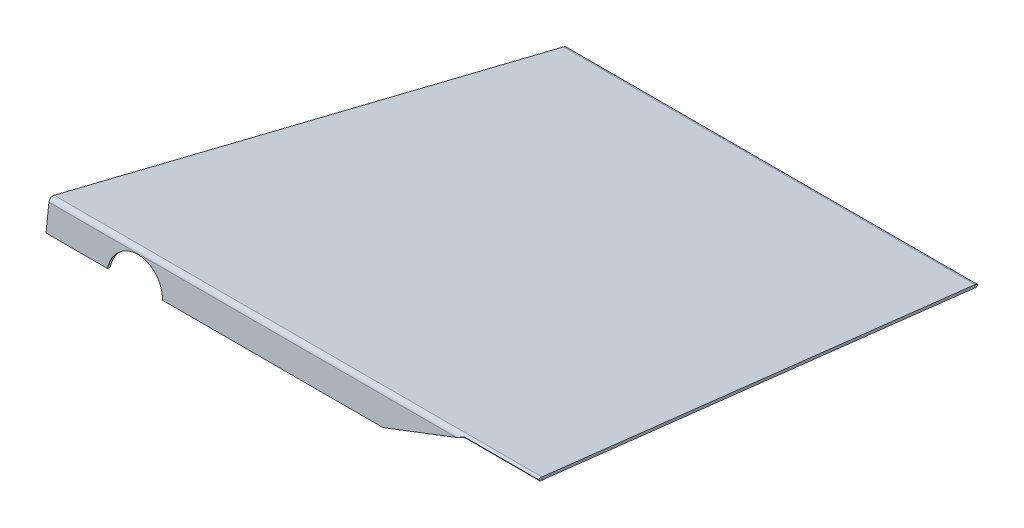
ISO-10303-21;
HEADER;
FILE_DESCRIPTION(('STEP AP214'),'2;1');
FILE_NAME('part.step','',(''),(''),'','','');
FILE_SCHEMA(('AUTOMOTIVE_DESIGN { 1 0 10303 214 1 1 1 1 }'));
ENDSEC;
DATA;
#1=APPLICATION_CONTEXT('core data for automotive mechanical design processes');
#2=APPLICATION_PROTOCOL_DEFINITION('international standard','automotive_design',2000,#1);
#3=PRODUCT_CONTEXT('',#1,'mechanical');
#4=PRODUCT('Part','Part','',(#3));
#5=PRODUCT_RELATED_PRODUCT_CATEGORY('part','',(#4));
#6=PRODUCT_DEFINITION_FORMATION('','',#4);
#7=PRODUCT_DEFINITION_CONTEXT('part definition',#1,'design');
#8=PRODUCT_DEFINITION('design','',#6,#7);
#9=PRODUCT_DEFINITION_SHAPE('','',#8);
#10=(LENGTH_UNIT() NAMED_UNIT(*) SI_UNIT(.MILLI.,.METRE.));
#11=(NAMED_UNIT(*) PLANE_ANGLE_UNIT() SI_UNIT($,.RADIAN.));
#12=(NAMED_UNIT(*) SI_UNIT($,.STERADIAN.) SOLID_ANGLE_UNIT());
#13=UNCERTAINTY_MEASURE_WITH_UNIT(LENGTH_MEASURE(1.E-05),#10,'distance_accuracy_value','');
#14=(GEOMETRIC_REPRESENTATION_CONTEXT(3) GLOBAL_UNCERTAINTY_ASSIGNED_CONTEXT((#13)) GLOBAL_UNIT_ASSIGNED_CONTEXT((#10,
#11,#12)) REPRESENTATION_CONTEXT('',''));
#15=CARTESIAN_POINT('',(0.,0.,0.));
#16=DIRECTION('',(0.,0.,1.));
#17=DIRECTION('',(1.,0.,0.));
#18=AXIS2_PLACEMENT_3D('',#15,#16,#17);
#19=CARTESIAN_POINT('',(-275.824024886329,332.806963333111,-148.582796348313));
#20=DIRECTION('',(0.,-0.993404762241954,0.114660273656605));
#21=DIRECTION('',(0.,-0.114660273656605,-0.993404762241954));
#22=AXIS2_PLACEMENT_3D('',#19,#20,#21);
#23=PLANE('',#22);
#24=DIRECTION('',(0.,-0.114660273656609,-0.993404762241953));
#25=VECTOR('',#24,1.);
#26=CARTESIAN_POINT('',(-247.624135177721,338.878637346236,-95.9784401308918));
#27=LINE('',#26,#25);
#28=CARTESIAN_POINT('',(-247.624135177723,332.806963333111,-148.582796348313));
#29=VERTEX_POINT('',#28);
#30=CARTESIAN_POINT('',(-247.624135177723,332.664257156518,-149.8191879154));
#31=VERTEX_POINT('',#30);
#32=EDGE_CURVE('E96',#29,#31,#27,.T.);
#33=ORIENTED_EDGE('',*,*,#32,.F.);
#34=DIRECTION('',(-1.,0.,0.));
#35=VECTOR('',#34,1.);
#36=CARTESIAN_POINT('',(-275.824024886329,332.806963333111,-148.582796348313));
#37=LINE('',#36,#35);
#38=CARTESIAN_POINT('',(-275.824024886329,332.806963333111,-148.582796348313));
#39=VERTEX_POINT('',#38);
#40=EDGE_CURVE('E623',#29,#39,#37,.T.);
#41=ORIENTED_EDGE('',*,*,#40,.T.);
#42=DIRECTION('',(0.,-0.114660273656605,-0.993404762241954));
#43=VECTOR('',#42,1.);
#44=CARTESIAN_POINT('',(-275.824024886329,332.806963333111,-148.582796348313));
#45=LINE('',#44,#43);
#46=CARTESIAN_POINT('',(-275.824024886329,332.664257156518,-149.8191879154));
#47=VERTEX_POINT('',#46);
#48=EDGE_CURVE('E619',#39,#47,#45,.T.);
#49=ORIENTED_EDGE('',*,*,#48,.T.);
#50=DIRECTION('',(-1.,0.,0.));
#51=VECTOR('',#50,1.);
#52=CARTESIAN_POINT('',(-275.824024886329,332.664257156518,-149.8191879154));
#53=LINE('',#52,#51);
#54=EDGE_CURVE('E607',#31,#47,#53,.T.);
#55=ORIENTED_EDGE('',*,*,#54,.F.);
#56=EDGE_LOOP('',(#33,#41,#49,#55));
#57=FACE_BOUND('',#56,.T.);
#58=ADVANCED_FACE('F81',(#57),#23,.T.);
#59=CARTESIAN_POINT('',(-2.63217050938053E-12,357.643485234279,-41.2797496520134));
#60=DIRECTION('',(0.,0.993404762241953,-0.114660273656609));
#61=DIRECTION('',(0.,0.114660273656609,0.993404762241953));
#62=AXIS2_PLACEMENT_3D('',#59,#60,#61);
#63=PLANE('',#62);
#64=DIRECTION('',(0.172013381605638,-0.112951217903472,-0.978597679806526));
#65=VECTOR('',#64,1.);
#66=CARTESIAN_POINT('',(-240.551572244694,321.82854127128,-351.576723116623));
#67=LINE('',#66,#65);
#68=CARTESIAN_POINT('',(-275.63766103811,344.867542212332,-151.969199758698));
#69=VERTEX_POINT('',#68);
#70=CARTESIAN_POINT('',(-240.737936092912,321.950915608864,-350.516484501672));
#71=VERTEX_POINT('',#70);
#72=EDGE_CURVE('E491',#69,#71,#67,.T.);
#73=ORIENTED_EDGE('',*,*,#72,.T.);
#74=DIRECTION('',(1.,0.,0.));
#75=VECTOR('',#74,1.);
#76=CARTESIAN_POINT('',(-2.48167277198549E-12,321.950915608866,-350.516484501672));
#77=LINE('',#76,#75);
#78=CARTESIAN_POINT('',(-51.9999999999785,321.950915608865,-350.516484501672));
#79=VERTEX_POINT('',#78);
#80=EDGE_CURVE('E459',#71,#79,#77,.T.);
#81=ORIENTED_EDGE('',*,*,#80,.T.);
#82=DIRECTION('',(0.,0.114660273656609,0.993404762241953));
#83=VECTOR('',#82,1.);
#84=CARTESIAN_POINT('',(-51.9999999999785,321.828541271282,-351.576723116623));
#85=LINE('',#84,#83);
#86=CARTESIAN_POINT('',(-51.9999999999785,344.867542212333,-151.969199758698));
#87=VERTEX_POINT('',#86);
#88=EDGE_CURVE('E488',#79,#87,#85,.T.);
#89=ORIENTED_EDGE('',*,*,#88,.T.);
#90=DIRECTION('',(1.,0.,0.));
#91=VECTOR('',#90,1.);
#92=CARTESIAN_POINT('',(-2.64271054348893E-12,344.867542212334,-151.969199758699));
#93=LINE('',#92,#91);
#94=EDGE_CURVE('E766',#69,#87,#93,.T.);
#95=ORIENTED_EDGE('',*,*,#94,.F.);
#96=EDGE_LOOP('',(#73,#81,#89,#95));
#97=FACE_BOUND('',#96,.T.);
#98=ADVANCED_FACE('F83',(#97),#63,.F.);
#99=CARTESIAN_POINT('',(-51.9999999999785,323.064932838368,-351.719429293216));
#100=DIRECTION('',(1.,0.,0.));
#101=DIRECTION('',(0.,1.,0.));
#102=AXIS2_PLACEMENT_3D('',#99,#100,#101);
#103=PLANE('',#102);
#104=DIRECTION('',(0.,-0.993404762241953,0.114660273656609));
#105=VECTOR('',#104,1.);
#106=CARTESIAN_POINT('',(-51.9999999999785,323.187307175951,-350.659190678265));
#107=LINE('',#106,#105);
#108=CARTESIAN_POINT('',(-51.9999999999785,323.187307175951,-350.659190678265));
#109=VERTEX_POINT('',#108);
#110=EDGE_CURVE('E469',#109,#79,#107,.T.);
#111=ORIENTED_EDGE('',*,*,#110,.F.);
#112=DIRECTION('',(0.,0.114660273656609,0.993404762241953));
#113=VECTOR('',#112,1.);
#114=CARTESIAN_POINT('',(-51.9999999999785,323.064932838368,-351.719429293216));
#115=LINE('',#114,#113);
#116=CARTESIAN_POINT('',(-51.9999999999785,346.10393377942,-152.111905935292));
#117=VERTEX_POINT('',#116);
#118=EDGE_CURVE('E484',#109,#117,#115,.T.);
#119=ORIENTED_EDGE('',*,*,#118,.T.);
#120=DIRECTION('',(0.,-0.993404762241953,0.114660273656609));
#121=VECTOR('',#120,1.);
#122=CARTESIAN_POINT('',(-51.9999999999785,346.10393377942,-152.111905935292));
#123=LINE('',#122,#121);
#124=EDGE_CURVE('E476',#117,#87,#123,.T.);
#125=ORIENTED_EDGE('',*,*,#124,.T.);
#126=ORIENTED_EDGE('',*,*,#88,.F.);
#127=EDGE_LOOP('',(#111,#119,#125,#126));
#128=FACE_BOUND('',#127,.T.);
#129=ADVANCED_FACE('F520',(#128),#103,.T.);
#130=CARTESIAN_POINT('',(-240.551572244694,323.064932838367,-351.719429293216));
#131=DIRECTION('',(-0.985094612993388,-0.0197231014075078,-0.170878912456383));
#132=DIRECTION('',(-0.170912158166921,0.,0.985286270172647));
#133=AXIS2_PLACEMENT_3D('',#130,#131,#132);
#134=PLANE('',#133);
#135=CARTESIAN_POINT('',(-240.737936092912,321.950915608864,-350.516484501672));
#136=CARTESIAN_POINT('',(-240.737936092912,323.18730717595,-350.659190678265));
#137=B_SPLINE_CURVE_WITH_KNOTS('',1,(#135,#136),.UNSPECIFIED.,.F.,.F.,(2,2),(0.,1.),.UNSPECIFIED.);
#138=CARTESIAN_POINT('',(-240.737936092912,323.18730717595,-350.659190678265));
#139=VERTEX_POINT('',#138);
#140=EDGE_CURVE('E89',#71,#139,#137,.T.);
#141=ORIENTED_EDGE('',*,*,#140,.F.);
#142=ORIENTED_EDGE('',*,*,#72,.F.);
#143=CARTESIAN_POINT('',(-275.63766103811,346.103933779418,-152.111905935291));
#144=CARTESIAN_POINT('',(-275.63766103811,344.867542212332,-151.969199758698));
#145=B_SPLINE_CURVE_WITH_KNOTS('',1,(#143,#144),.UNSPECIFIED.,.F.,.F.,(2,2),(0.,1.),.UNSPECIFIED.);
#146=CARTESIAN_POINT('',(-275.63766103811,346.103933779418,-152.111905935291));
#147=VERTEX_POINT('',#146);
#148=EDGE_CURVE('E504',#69,#147,#145,.F.);
#149=ORIENTED_EDGE('',*,*,#148,.T.);
#150=DIRECTION('',(0.172013381605638,-0.112951217903472,-0.978597679806526));
#151=VECTOR('',#150,1.);
#152=CARTESIAN_POINT('',(-240.551572244694,323.064932838367,-351.719429293216));
#153=LINE('',#152,#151);
#154=EDGE_CURVE('E487',#147,#139,#153,.T.);
#155=ORIENTED_EDGE('',*,*,#154,.T.);
#156=EDGE_LOOP('',(#141,#142,#149,#155));
#157=FACE_BOUND('',#156,.T.);
#158=ADVANCED_FACE('F510',(#157),#134,.T.);
#159=CARTESIAN_POINT('',(-2.64068036971816E-12,358.879876801365,-41.4224558286064));
#160=DIRECTION('',(0.,0.993404762241953,-0.114660273656609));
#161=DIRECTION('',(0.,0.114660273656609,0.993404762241953));
#162=AXIS2_PLACEMENT_3D('',#159,#160,#161);
#163=PLANE('',#162);
#164=DIRECTION('',(1.,0.,0.));
#165=VECTOR('',#164,1.);
#166=CARTESIAN_POINT('',(-2.49018263232312E-12,323.187307175952,-350.659190678265));
#167=LINE('',#166,#165);
#168=EDGE_CURVE('E473',#139,#109,#167,.T.);
#169=ORIENTED_EDGE('',*,*,#168,.F.);
#170=ORIENTED_EDGE('',*,*,#154,.F.);
#171=DIRECTION('',(1.,0.,0.));
#172=VECTOR('',#171,1.);
#173=CARTESIAN_POINT('',(-2.65122040382657E-12,346.10393377942,-152.111905935292));
#174=LINE('',#173,#172);
#175=EDGE_CURVE('E486',#147,#117,#174,.T.);
#176=ORIENTED_EDGE('',*,*,#175,.T.);
#177=ORIENTED_EDGE('',*,*,#118,.F.);
#178=EDGE_LOOP('',(#169,#170,#176,#177));
#179=FACE_BOUND('',#178,.T.);
#180=ADVANCED_FACE('F519',(#179),#163,.T.);
#181=CARTESIAN_POINT('',(-275.63766103811,346.103933779418,-152.111905935291));
#182=CARTESIAN_POINT('',(-275.668727200433,346.133674885235,-151.854232067867));
#183=CARTESIAN_POINT('',(-275.69978232085,346.112168472984,-151.590838656424));
#184=CARTESIAN_POINT('',(-275.761903603589,345.969933112817,-151.092045234476));
#185=CARTESIAN_POINT('',(-275.792958724005,345.849283485954,-150.856923388411));
#186=CARTESIAN_POINT('',(-275.824024886329,345.688110684567,-150.653690311817));
#187=CARTESIAN_POINT('',(-275.63766103811,344.867542212332,-151.969199758698));
#188=CARTESIAN_POINT('',(-275.668726753126,344.878599643743,-151.873399315599));
#189=CARTESIAN_POINT('',(-275.69978232085,344.87060382917,-151.775469616555));
#190=CARTESIAN_POINT('',(-275.761903603589,344.817721451672,-151.59002078019));
#191=CARTESIAN_POINT('',(-275.792959171312,344.772863676315,-151.502602595609));
#192=CARTESIAN_POINT('',(-275.824024886329,344.712941318092,-151.427042667919));
#193=B_SPLINE_SURFACE_WITH_KNOTS('',1,3,((#181,#182,#183,#184,#185,#186),(#187,#188,#189,#190,
#191,#192)),.UNSPECIFIED.,.F.,.F.,.F.,(2,2),(4,2,4),(0.,1.),(0.,0.5,1.),.UNSPECIFIED.);
#194=CARTESIAN_POINT('',(-275.63766103811,344.867542212332,-151.969199758698));
#195=CARTESIAN_POINT('',(-275.668726753126,344.878599643743,-151.873399315599));
#196=CARTESIAN_POINT('',(-275.69978232085,344.87060382917,-151.775469616555));
#197=CARTESIAN_POINT('',(-275.761903603589,344.817721451672,-151.59002078019));
#198=CARTESIAN_POINT('',(-275.792959171312,344.772863676315,-151.502602595609));
#199=CARTESIAN_POINT('',(-275.824024886329,344.712941318092,-151.427042667919));
#200=B_SPLINE_CURVE_WITH_KNOTS('',3,(#194,#195,#196,#197,#198,#199),.UNSPECIFIED.,.F.,.F.,(4,2,
4),(0.,0.5,1.),.UNSPECIFIED.);
#201=CARTESIAN_POINT('',(-275.824024886329,344.712941318092,-151.427042667919));
#202=VERTEX_POINT('',#201);
#203=EDGE_CURVE('E689',#69,#202,#200,.T.);
#204=CARTESIAN_POINT('',(-275.824024886329,344.712941318092,-151.427042667919));
#205=CARTESIAN_POINT('',(-275.824024886329,345.688110684567,-150.653690311817));
#206=B_SPLINE_CURVE_WITH_KNOTS('',1,(#204,#205),.UNSPECIFIED.,.F.,.F.,(2,2),(0.,1.),.UNSPECIFIED.);
#207=CARTESIAN_POINT('',(-275.824024886329,345.688110684567,-150.653690311817));
#208=VERTEX_POINT('',#207);
#209=EDGE_CURVE('E746',#202,#208,#206,.T.);
#210=CARTESIAN_POINT('',(-275.824024886329,345.688110684567,-150.653690311817));
#211=CARTESIAN_POINT('',(-275.792958724005,345.849283485954,-150.856923388411));
#212=CARTESIAN_POINT('',(-275.761903603589,345.969933112817,-151.092045234476));
#213=CARTESIAN_POINT('',(-275.69978232085,346.112168472984,-151.590838656424));
#214=CARTESIAN_POINT('',(-275.668727200433,346.133674885235,-151.854232067867));
#215=CARTESIAN_POINT('',(-275.63766103811,346.103933779418,-152.111905935291));
#216=B_SPLINE_CURVE_WITH_KNOTS('',3,(#210,#211,#212,#213,#214,#215),.UNSPECIFIED.,.F.,.F.,(4,2,
4),(0.,0.5,1.),.UNSPECIFIED.);
#217=EDGE_CURVE('E635',#147,#208,#216,.F.);
#218=ORIENTED_EDGE('',*,*,#148,.F.);
#219=ORIENTED_EDGE('',*,*,#203,.T.);
#220=ORIENTED_EDGE('',*,*,#209,.T.);
#221=ORIENTED_EDGE('',*,*,#217,.F.);
#222=EDGE_LOOP('',(#218,#219,#220,#221));
#223=FACE_BOUND('',#222,.T.);
#224=ADVANCED_FACE('F706',(#223),#193,.T.);
#225=CARTESIAN_POINT('',(-275.824024886329,344.135800264464,-151.884741001123));
#226=DIRECTION('',(-1.,-3.54760169755225E-13,0.));
#227=DIRECTION('',(3.54760169755225E-13,-1.,0.));
#228=AXIS2_PLACEMENT_3D('',#225,#226,#227);
#229=PLANE('',#228);
#230=ORIENTED_EDGE('',*,*,#209,.F.);
#231=CARTESIAN_POINT('',(-275.824024886329,344.135800264464,-151.884741001123));
#232=DIRECTION('',(1.,0.,0.));
#233=DIRECTION('',(0.,1.,0.));
#234=AXIS2_PLACEMENT_3D('',#231,#232,#233);
#235=CIRCLE('',#234,0.7366);
#236=CARTESIAN_POINT('',(-275.824024886329,344.22025902204,-151.152999053255));
#237=VERTEX_POINT('',#236);
#238=EDGE_CURVE('E858',#202,#237,#235,.T.);
#239=ORIENTED_EDGE('',*,*,#238,.T.);
#240=DIRECTION('',(0.,0.114660273656605,0.993404762241954));
#241=VECTOR('',#240,1.);
#242=CARTESIAN_POINT('',(-275.824024886329,344.362965198633,-149.916607486169));
#243=LINE('',#242,#241);
#244=CARTESIAN_POINT('',(-275.824024886329,344.362965198633,-149.916607486169));
#245=VERTEX_POINT('',#244);
#246=EDGE_CURVE('E624',#237,#245,#243,.T.);
#247=ORIENTED_EDGE('',*,*,#246,.T.);
#248=CARTESIAN_POINT('',(-275.824024886329,344.135800264464,-151.884741001123));
#249=DIRECTION('',(1.,3.54760169755225E-13,0.));
#250=DIRECTION('',(3.54760169755225E-13,-1.,0.));
#251=AXIS2_PLACEMENT_3D('',#248,#249,#250);
#252=CIRCLE('',#251,1.98120000000002);
#253=EDGE_CURVE('E670',#208,#245,#252,.T.);
#254=ORIENTED_EDGE('',*,*,#253,.F.);
#255=EDGE_LOOP('',(#230,#239,#247,#254));
#256=FACE_BOUND('',#255,.T.);
#257=ADVANCED_FACE('F717',(#256),#229,.T.);
#258=CARTESIAN_POINT('',(-89.0076488850071,344.362965198634,-149.916607486169));
#259=CARTESIAN_POINT('',(-88.5134118988918,344.620603302063,-149.946344464052));
#260=CARTESIAN_POINT('',(-88.0192133899108,344.872207487118,-150.027292674442));
#261=CARTESIAN_POINT('',(-87.0307778948145,345.325483285888,-150.279417297814));
#262=CARTESIAN_POINT('',(-86.5365793858335,345.526960253255,-150.450485443077));
#263=CARTESIAN_POINT('',(-86.0423423997183,345.688110684568,-150.653690311817));
#264=CARTESIAN_POINT('',(-89.0076488850071,344.220259022041,-151.152999053256));
#265=CARTESIAN_POINT('',(-88.5134278701683,344.316044452267,-151.164054751858));
#266=CARTESIAN_POINT('',(-88.0192133899108,344.409592693401,-151.194151238639));
#267=CARTESIAN_POINT('',(-87.0307778948145,344.578118310892,-151.287889880662));
#268=CARTESIAN_POINT('',(-86.5365634145571,344.653028350295,-151.351494581215));
#269=CARTESIAN_POINT('',(-86.0423423997183,344.712941318094,-151.427042667919));
#270=B_SPLINE_SURFACE_WITH_KNOTS('',1,3,((#258,#259,#260,#261,#262,#263),(#264,#265,#266,#267,
#268,#269)),.UNSPECIFIED.,.F.,.F.,.F.,(2,2),(4,2,4),(0.,1.),(0.,0.5,1.),.UNSPECIFIED.);
#271=CARTESIAN_POINT('',(-89.0076488850071,344.362965198634,-149.916607486169));
#272=CARTESIAN_POINT('',(-89.0076488850071,344.220259022041,-151.152999053256));
#273=B_SPLINE_CURVE_WITH_KNOTS('',1,(#271,#272),.UNSPECIFIED.,.F.,.F.,(2,2),(0.,1.),.UNSPECIFIED.);
#274=CARTESIAN_POINT('',(-89.0076488850071,344.362965198634,-149.916607486169));
#275=VERTEX_POINT('',#274);
#276=CARTESIAN_POINT('',(-89.0076488850071,344.220259022041,-151.152999053256));
#277=VERTEX_POINT('',#276);
#278=EDGE_CURVE('E627',#275,#277,#273,.T.);
#279=CARTESIAN_POINT('',(-89.0076488850071,344.220259022041,-151.152999053256));
#280=CARTESIAN_POINT('',(-88.5134278701683,344.316044452267,-151.164054751858));
#281=CARTESIAN_POINT('',(-88.0192133899108,344.409592693401,-151.194151238639));
#282=CARTESIAN_POINT('',(-87.0307778948145,344.578118310892,-151.287889880662));
#283=CARTESIAN_POINT('',(-86.5365634145571,344.653028350295,-151.351494581215));
#284=CARTESIAN_POINT('',(-86.0423423997183,344.712941318094,-151.427042667919));
#285=B_SPLINE_CURVE_WITH_KNOTS('',3,(#279,#280,#281,#282,#283,#284),.UNSPECIFIED.,.F.,.F.,(4,2,
4),(0.,0.5,1.),.UNSPECIFIED.);
#286=CARTESIAN_POINT('',(-86.0423423997183,344.712941318094,-151.427042667919));
#287=VERTEX_POINT('',#286);
#288=EDGE_CURVE('E639',#277,#287,#285,.T.);
#289=CARTESIAN_POINT('',(-86.0423423997183,344.712941318094,-151.427042667919));
#290=CARTESIAN_POINT('',(-86.0423423997183,345.688110684568,-150.653690311817));
#291=B_SPLINE_CURVE_WITH_KNOTS('',1,(#289,#290),.UNSPECIFIED.,.F.,.F.,(2,2),(0.,1.),.UNSPECIFIED.);
#292=CARTESIAN_POINT('',(-86.0423423997183,345.688110684568,-150.653690311817));
#293=VERTEX_POINT('',#292);
#294=EDGE_CURVE('E764',#287,#293,#291,.T.);
#295=CARTESIAN_POINT('',(-86.0423423997183,345.688110684568,-150.653690311817));
#296=CARTESIAN_POINT('',(-86.5365793858335,345.526960253255,-150.450485443077));
#297=CARTESIAN_POINT('',(-87.0307778948145,345.325483285888,-150.279417297814));
#298=CARTESIAN_POINT('',(-88.0192133899108,344.872207487118,-150.027292674442));
#299=CARTESIAN_POINT('',(-88.5134118988918,344.620603302063,-149.946344464052));
#300=CARTESIAN_POINT('',(-89.0076488850071,344.362965198634,-149.916607486169));
#301=B_SPLINE_CURVE_WITH_KNOTS('',3,(#295,#296,#297,#298,#299,#300),.UNSPECIFIED.,.F.,.F.,(4,2,
4),(0.,0.5,1.),.UNSPECIFIED.);
#302=EDGE_CURVE('E796',#275,#293,#301,.F.);
#303=ORIENTED_EDGE('',*,*,#278,.T.);
#304=ORIENTED_EDGE('',*,*,#288,.T.);
#305=ORIENTED_EDGE('',*,*,#294,.T.);
#306=ORIENTED_EDGE('',*,*,#302,.F.);
#307=EDGE_LOOP('',(#303,#304,#305,#306));
#308=FACE_BOUND('',#307,.T.);
#309=ADVANCED_FACE('F799',(#308),#270,.T.);
#310=CARTESIAN_POINT('',(-69.0211711998484,345.688110684568,-150.653690311817));
#311=DIRECTION('',(0.,-0.621366186809043,0.783520300879555));
#312=DIRECTION('',(1.,0.,0.));
#313=AXIS2_PLACEMENT_3D('',#310,#311,#312);
#314=PLANE('',#313);
#315=ORIENTED_EDGE('',*,*,#294,.F.);
#316=DIRECTION('',(1.,0.,0.));
#317=VECTOR('',#316,1.);
#318=CARTESIAN_POINT('',(-387.659197503809,344.712941318091,-151.427042667919));
#319=LINE('',#318,#317);
#320=CARTESIAN_POINT('',(-51.9999999999785,344.712941318094,-151.427042667919));
#321=VERTEX_POINT('',#320);
#322=EDGE_CURVE('E636',#287,#321,#319,.T.);
#323=ORIENTED_EDGE('',*,*,#322,.T.);
#324=DIRECTION('',(0.,0.783520300879573,0.621366186809021));
#325=VECTOR('',#324,1.);
#326=CARTESIAN_POINT('',(-51.9999999999785,345.688110684569,-150.653690311817));
#327=LINE('',#326,#325);
#328=CARTESIAN_POINT('',(-51.9999999999785,345.688110684569,-150.653690311817));
#329=VERTEX_POINT('',#328);
#330=EDGE_CURVE('E631',#321,#329,#327,.T.);
#331=ORIENTED_EDGE('',*,*,#330,.T.);
#332=DIRECTION('',(1.,0.,0.));
#333=VECTOR('',#332,1.);
#334=CARTESIAN_POINT('',(-51.9999999999785,345.688110684569,-150.653690311817));
#335=LINE('',#334,#333);
#336=EDGE_CURVE('E632',#293,#329,#335,.T.);
#337=ORIENTED_EDGE('',*,*,#336,.F.);
#338=EDGE_LOOP('',(#315,#323,#331,#337));
#339=FACE_BOUND('',#338,.T.);
#340=ADVANCED_FACE('F819',(#339),#314,.T.);
#341=CARTESIAN_POINT('',(-51.9999999999785,344.135800264466,-151.884741001123));
#342=DIRECTION('',(1.,0.,0.));
#343=DIRECTION('',(0.,1.,0.));
#344=AXIS2_PLACEMENT_3D('',#341,#342,#343);
#345=PLANE('',#344);
#346=CARTESIAN_POINT('',(-51.9999999999785,344.135800264466,-151.884741001123));
#347=DIRECTION('',(1.,0.,0.));
#348=DIRECTION('',(0.,1.,0.));
#349=AXIS2_PLACEMENT_3D('',#346,#347,#348);
#350=CIRCLE('',#349,0.7366);
#351=EDGE_CURVE('E633',#321,#87,#350,.F.);
#352=ORIENTED_EDGE('',*,*,#351,.T.);
#353=ORIENTED_EDGE('',*,*,#124,.F.);
#354=CARTESIAN_POINT('',(-51.9999999999785,344.135800264466,-151.884741001123));
#355=DIRECTION('',(-1.,0.,0.));
#356=DIRECTION('',(0.,1.,0.));
#357=AXIS2_PLACEMENT_3D('',#354,#355,#356);
#358=CIRCLE('',#357,1.9812);
#359=EDGE_CURVE('E628',#329,#117,#358,.T.);
#360=ORIENTED_EDGE('',*,*,#359,.F.);
#361=ORIENTED_EDGE('',*,*,#330,.F.);
#362=EDGE_LOOP('',(#352,#353,#360,#361));
#363=FACE_BOUND('',#362,.T.);
#364=ADVANCED_FACE('F655',(#363),#345,.T.);
#365=CARTESIAN_POINT('',(-387.659197503809,344.135800264464,-151.884741001123));
#366=DIRECTION('',(1.,0.,0.));
#367=DIRECTION('',(0.,1.,0.));
#368=AXIS2_PLACEMENT_3D('',#365,#366,#367);
#369=CYLINDRICAL_SURFACE('',#368,1.9812);
#370=ORIENTED_EDGE('',*,*,#336,.T.);
#371=ORIENTED_EDGE('',*,*,#359,.T.);
#372=ORIENTED_EDGE('',*,*,#175,.F.);
#373=ORIENTED_EDGE('',*,*,#217,.T.);
#374=ORIENTED_EDGE('',*,*,#253,.T.);
#375=DIRECTION('',(1.,0.,0.));
#376=VECTOR('',#375,1.);
#377=CARTESIAN_POINT('',(-2.63858180324242E-12,344.362965198635,-149.916607486169));
#378=LINE('',#377,#376);
#379=EDGE_CURVE('E452',#245,#275,#378,.T.);
#380=ORIENTED_EDGE('',*,*,#379,.T.);
#381=ORIENTED_EDGE('',*,*,#302,.T.);
#382=EDGE_LOOP('',(#370,#371,#372,#373,#374,#380,#381));
#383=FACE_BOUND('',#382,.T.);
#384=ADVANCED_FACE('F585',(#383),#369,.T.);
#385=CARTESIAN_POINT('',(-387.659197503809,344.135800264464,-151.884741001123));
#386=DIRECTION('',(1.,0.,0.));
#387=DIRECTION('',(0.,1.,0.));
#388=AXIS2_PLACEMENT_3D('',#385,#386,#387);
#389=CYLINDRICAL_SURFACE('',#388,0.7366);
#390=ORIENTED_EDGE('',*,*,#322,.F.);
#391=ORIENTED_EDGE('',*,*,#288,.F.);
#392=DIRECTION('',(1.,0.,0.));
#393=VECTOR('',#392,1.);
#394=CARTESIAN_POINT('',(-2.63928922038348E-12,344.220259022042,-151.152999053256));
#395=LINE('',#394,#393);
#396=EDGE_CURVE('E615',#237,#277,#395,.T.);
#397=ORIENTED_EDGE('',*,*,#396,.F.);
#398=ORIENTED_EDGE('',*,*,#238,.F.);
#399=ORIENTED_EDGE('',*,*,#203,.F.);
#400=ORIENTED_EDGE('',*,*,#94,.T.);
#401=ORIENTED_EDGE('',*,*,#351,.F.);
#402=EDGE_LOOP('',(#390,#391,#397,#398,#399,#400,#401));
#403=FACE_BOUND('',#402,.T.);
#404=ADVANCED_FACE('F577',(#403),#389,.F.);
#405=DIRECTION('',(0.,-0.114660273656609,-0.993404762241953));
#406=VECTOR('',#405,1.);
#407=CARTESIAN_POINT('',(-222.375864822236,338.878637346236,-95.9784401308928));
#408=LINE('',#407,#406);
#409=CARTESIAN_POINT('',(-222.375864822238,332.664257156518,-149.8191879154));
#410=VERTEX_POINT('',#409);
#411=CARTESIAN_POINT('',(-222.375864822238,332.806963333111,-148.582796348313));
#412=VERTEX_POINT('',#411);
#413=EDGE_CURVE('E591',#410,#412,#408,.F.);
#414=ORIENTED_EDGE('',*,*,#413,.F.);
#415=CARTESIAN_POINT('',(-121.327814169152,332.664257156519,-149.8191879154));
#416=VERTEX_POINT('',#415);
#417=EDGE_CURVE('E594',#416,#410,#53,.T.);
#418=ORIENTED_EDGE('',*,*,#417,.F.);
#419=DIRECTION('',(0.,-0.114660273656605,-0.993404762241954));
#420=VECTOR('',#419,1.);
#421=CARTESIAN_POINT('',(-121.327814169152,332.806963333112,-148.582796348314));
#422=LINE('',#421,#420);
#423=CARTESIAN_POINT('',(-121.327814169152,332.806963333112,-148.582796348314));
#424=VERTEX_POINT('',#423);
#425=EDGE_CURVE('E609',#424,#416,#422,.T.);
#426=ORIENTED_EDGE('',*,*,#425,.F.);
#427=EDGE_CURVE('E596',#424,#412,#37,.T.);
#428=ORIENTED_EDGE('',*,*,#427,.T.);
#429=EDGE_LOOP('',(#414,#418,#426,#428));
#430=FACE_BOUND('',#429,.T.);
#431=ADVANCED_FACE('F357',(#430),#23,.T.);
#432=CARTESIAN_POINT('',(-1.83873852757375E-12,235.793992321851,-137.385413139391));
#433=DIRECTION('',(0.,0.114660273656605,0.993404762241954));
#434=DIRECTION('',(0.,-0.993404762241954,0.114660273656605));
#435=AXIS2_PLACEMENT_3D('',#432,#433,#434);
#436=PLANE('',#435);
#437=CARTESIAN_POINT('',(-234.999999999981,331.43002727996,-148.423868315489));
#438=DIRECTION('',(0.,0.114660273656605,0.993404762241954));
#439=DIRECTION('',(0.,-0.993404762241954,0.114660273656605));
#440=AXIS2_PLACEMENT_3D('',#437,#438,#439);
#441=CIRCLE('',#440,12.7);
#442=EDGE_CURVE('E248',#412,#29,#441,.T.);
#443=ORIENTED_EDGE('',*,*,#442,.F.);
#444=ORIENTED_EDGE('',*,*,#427,.F.);
#445=DIRECTION('',(-0.940910948413241,-0.336420577666029,0.0388301697002591));
#446=VECTOR('',#445,1.);
#447=CARTESIAN_POINT('',(-121.327814169152,332.806963333112,-148.582796348314));
#448=LINE('',#447,#446);
#449=EDGE_CURVE('E606',#275,#424,#448,.T.);
#450=ORIENTED_EDGE('',*,*,#449,.F.);
#451=ORIENTED_EDGE('',*,*,#379,.F.);
#452=DIRECTION('',(0.,0.993404762241954,-0.114660273656604));
#453=VECTOR('',#452,1.);
#454=CARTESIAN_POINT('',(-275.824024886329,345.423203813584,-150.038981823752));
#455=LINE('',#454,#453);
#456=EDGE_CURVE('E616',#39,#245,#455,.T.);
#457=ORIENTED_EDGE('',*,*,#456,.F.);
#458=ORIENTED_EDGE('',*,*,#40,.F.);
#459=EDGE_LOOP('',(#443,#444,#450,#451,#457,#458));
#460=FACE_BOUND('',#459,.T.);
#461=ADVANCED_FACE('F576',(#460),#436,.T.);
#462=CARTESIAN_POINT('',(-275.824024886329,345.423203813584,-150.038981823752));
#463=DIRECTION('',(-1.,0.,0.));
#464=DIRECTION('',(0.,-1.,0.));
#465=AXIS2_PLACEMENT_3D('',#462,#463,#464);
#466=PLANE('',#465);
#467=ORIENTED_EDGE('',*,*,#246,.F.);
#468=DIRECTION('',(0.,0.993404762241954,-0.114660273656604));
#469=VECTOR('',#468,1.);
#470=CARTESIAN_POINT('',(-275.824024886329,345.280497636991,-151.275373390839));
#471=LINE('',#470,#469);
#472=EDGE_CURVE('E613',#47,#237,#471,.T.);
#473=ORIENTED_EDGE('',*,*,#472,.F.);
#474=ORIENTED_EDGE('',*,*,#48,.F.);
#475=ORIENTED_EDGE('',*,*,#456,.T.);
#476=EDGE_LOOP('',(#467,#473,#474,#475));
#477=FACE_BOUND('',#476,.T.);
#478=ADVANCED_FACE('F583',(#477),#466,.T.);
#479=CARTESIAN_POINT('',(-1.83944594471481E-12,235.651286145258,-138.621804706478));
#480=DIRECTION('',(0.,0.114660273656605,0.993404762241954));
#481=DIRECTION('',(0.,-0.993404762241954,0.114660273656605));
#482=AXIS2_PLACEMENT_3D('',#479,#480,#481);
#483=PLANE('',#482);
#484=ORIENTED_EDGE('',*,*,#417,.T.);
#485=CARTESIAN_POINT('',(-234.999999999981,331.287321103366,-149.660259882575));
#486=DIRECTION('',(0.,0.114660273656605,0.993404762241954));
#487=DIRECTION('',(0.,-0.993404762241954,0.114660273656605));
#488=AXIS2_PLACEMENT_3D('',#485,#486,#487);
#489=CIRCLE('',#488,12.7);
#490=EDGE_CURVE('E598',#410,#31,#489,.T.);
#491=ORIENTED_EDGE('',*,*,#490,.T.);
#492=ORIENTED_EDGE('',*,*,#54,.T.);
#493=ORIENTED_EDGE('',*,*,#472,.T.);
#494=ORIENTED_EDGE('',*,*,#396,.T.);
#495=DIRECTION('',(-0.940910948413241,-0.336420577666029,0.0388301697002591));
#496=VECTOR('',#495,1.);
#497=CARTESIAN_POINT('',(-121.327814169152,332.664257156519,-149.8191879154));
#498=LINE('',#497,#496);
#499=EDGE_CURVE('E604',#277,#416,#498,.T.);
#500=ORIENTED_EDGE('',*,*,#499,.T.);
#501=EDGE_LOOP('',(#484,#491,#492,#493,#494,#500));
#502=FACE_BOUND('',#501,.T.);
#503=ADVANCED_FACE('F601',(#502),#483,.F.);
#504=CARTESIAN_POINT('',(-121.327814169152,332.806963333112,-148.582796348314));
#505=DIRECTION('',(0.338654081853587,-0.934705416999307,0.107885106831558));
#506=DIRECTION('',(0.94019297672741,0.340642285267773,0.));
#507=AXIS2_PLACEMENT_3D('',#504,#505,#506);
#508=PLANE('',#507);
#509=ORIENTED_EDGE('',*,*,#278,.F.);
#510=ORIENTED_EDGE('',*,*,#449,.T.);
#511=ORIENTED_EDGE('',*,*,#425,.T.);
#512=ORIENTED_EDGE('',*,*,#499,.F.);
#513=EDGE_LOOP('',(#509,#510,#511,#512));
#514=FACE_BOUND('',#513,.T.);
#515=ADVANCED_FACE('F657',(#514),#508,.T.);
#516=CARTESIAN_POINT('',(-240.551572244694,321.219173660996,-350.432025744096));
#517=DIRECTION('',(-1.,0.,0.));
#518=DIRECTION('',(0.,0.,1.));
#519=AXIS2_PLACEMENT_3D('',#516,#517,#518);
#520=PLANE('',#519);
#521=DIRECTION('',(0.,-0.114660273656612,-0.993404762241953));
#522=VECTOR('',#521,1.);
#523=CARTESIAN_POINT('',(-240.551572244694,320.992008726828,-352.40015925905));
#524=LINE('',#523,#522);
#525=CARTESIAN_POINT('',(-240.551572244694,321.134714903421,-351.163767691964));
#526=VERTEX_POINT('',#525);
#527=CARTESIAN_POINT('',(-240.551572244694,320.992008726828,-352.40015925905));
#528=VERTEX_POINT('',#527);
#529=EDGE_CURVE('E239',#526,#528,#524,.T.);
#530=ORIENTED_EDGE('',*,*,#529,.F.);
#531=CARTESIAN_POINT('',(-240.551572244694,321.219173660996,-350.432025744096));
#532=DIRECTION('',(-1.,0.,0.));
#533=DIRECTION('',(0.,-1.,0.));
#534=AXIS2_PLACEMENT_3D('',#531,#532,#533);
#535=CIRCLE('',#534,0.7366);
#536=CARTESIAN_POINT('',(-240.551572244694,321.6768719942,-351.009166797724));
#537=VERTEX_POINT('',#536);
#538=EDGE_CURVE('E240',#526,#537,#535,.F.);
#539=ORIENTED_EDGE('',*,*,#538,.T.);
#540=CARTESIAN_POINT('',(-240.551572244694,322.450224350302,-351.984336164199));
#541=CARTESIAN_POINT('',(-240.551572244694,321.6768719942,-351.009166797724));
#542=B_SPLINE_CURVE_WITH_KNOTS('',1,(#540,#541),.UNSPECIFIED.,.F.,.F.,(2,2),(0.,1.),.UNSPECIFIED.);
#543=CARTESIAN_POINT('',(-240.551572244694,322.450224350302,-351.984336164199));
#544=VERTEX_POINT('',#543);
#545=EDGE_CURVE('E432',#537,#544,#542,.F.);
#546=ORIENTED_EDGE('',*,*,#545,.T.);
#547=CARTESIAN_POINT('',(-240.551572244694,321.219173660996,-350.432025744096));
#548=DIRECTION('',(1.,0.,0.));
#549=DIRECTION('',(0.,0.,1.));
#550=AXIS2_PLACEMENT_3D('',#547,#548,#549);
#551=CIRCLE('',#550,1.98120000000002);
#552=EDGE_CURVE('E462',#528,#544,#551,.T.);
#553=ORIENTED_EDGE('',*,*,#552,.F.);
#554=EDGE_LOOP('',(#530,#539,#546,#553));
#555=FACE_BOUND('',#554,.T.);
#556=ADVANCED_FACE('F355',(#555),#520,.T.);
#557=CARTESIAN_POINT('',(-240.551572244694,322.450224350302,-351.984336164199));
#558=CARTESIAN_POINT('',(-240.582638407017,322.653457426896,-351.823163362812));
#559=CARTESIAN_POINT('',(-240.613693527433,322.824497364305,-351.621708765519));
#560=CARTESIAN_POINT('',(-240.675814810173,323.076621987677,-351.168432966749));
#561=CARTESIAN_POINT('',(-240.706869930589,323.157566070133,-350.916864545689));
#562=CARTESIAN_POINT('',(-240.737936092912,323.18730717595,-350.659190678265));
#563=CARTESIAN_POINT('',(-240.551572244694,321.6768719942,-351.009166797724));
#564=CARTESIAN_POINT('',(-240.58263795971,321.75243192189,-350.949244439501));
#565=CARTESIAN_POINT('',(-240.613693527433,321.816024781457,-350.874343790523));
#566=CARTESIAN_POINT('',(-240.675814810173,321.90976342348,-350.705818173031));
#567=CARTESIAN_POINT('',(-240.706870377896,321.939858177452,-350.612284944771));
#568=CARTESIAN_POINT('',(-240.737936092912,321.950915608864,-350.516484501672));
#569=B_SPLINE_SURFACE_WITH_KNOTS('',1,3,((#557,#558,#559,#560,#561,#562),(#563,#564,#565,#566,
#567,#568)),.UNSPECIFIED.,.F.,.F.,.F.,(2,2),(4,2,4),(0.,1.),(0.,0.5,1.),.UNSPECIFIED.);
#570=CARTESIAN_POINT('',(-240.551572244694,321.6768719942,-351.009166797724));
#571=CARTESIAN_POINT('',(-240.58263795971,321.75243192189,-350.949244439501));
#572=CARTESIAN_POINT('',(-240.613693527433,321.816024781457,-350.874343790523));
#573=CARTESIAN_POINT('',(-240.675814810173,321.90976342348,-350.705818173031));
#574=CARTESIAN_POINT('',(-240.706870377896,321.939858177452,-350.612284944771));
#575=CARTESIAN_POINT('',(-240.737936092912,321.950915608864,-350.516484501672));
#576=B_SPLINE_CURVE_WITH_KNOTS('',3,(#570,#571,#572,#573,#574,#575),.UNSPECIFIED.,.F.,.F.,(4,2,
4),(0.,0.5,1.),.UNSPECIFIED.);
#577=EDGE_CURVE('E243',#537,#71,#576,.T.);
#578=CARTESIAN_POINT('',(-240.737936092912,323.18730717595,-350.659190678265));
#579=CARTESIAN_POINT('',(-240.706869930589,323.157566070133,-350.916864545689));
#580=CARTESIAN_POINT('',(-240.675814810173,323.076621987677,-351.168432966749));
#581=CARTESIAN_POINT('',(-240.613693527433,322.824497364305,-351.621708765519));
#582=CARTESIAN_POINT('',(-240.582638407017,322.653457426896,-351.823163362812));
#583=CARTESIAN_POINT('',(-240.551572244694,322.450224350302,-351.984336164199));
#584=B_SPLINE_CURVE_WITH_KNOTS('',3,(#578,#579,#580,#581,#582,#583),.UNSPECIFIED.,.F.,.F.,(4,2,
4),(0.,0.5,1.),.UNSPECIFIED.);
#585=EDGE_CURVE('E266',#544,#139,#584,.F.);
#586=ORIENTED_EDGE('',*,*,#545,.F.);
#587=ORIENTED_EDGE('',*,*,#577,.T.);
#588=ORIENTED_EDGE('',*,*,#140,.T.);
#589=ORIENTED_EDGE('',*,*,#585,.F.);
#590=EDGE_LOOP('',(#586,#587,#588,#589));
#591=FACE_BOUND('',#590,.T.);
#592=ADVANCED_FACE('F399',(#591),#569,.T.);
#593=CARTESIAN_POINT('',(-51.9999999999785,321.219173660998,-350.432025744096));
#594=DIRECTION('',(1.,0.,0.));
#595=DIRECTION('',(0.,0.,-1.));
#596=AXIS2_PLACEMENT_3D('',#593,#594,#595);
#597=PLANE('',#596);
#598=ORIENTED_EDGE('',*,*,#110,.T.);
#599=CARTESIAN_POINT('',(-51.9999999999785,321.219173660998,-350.432025744096));
#600=DIRECTION('',(-1.,0.,0.));
#601=DIRECTION('',(0.,-1.,0.));
#602=AXIS2_PLACEMENT_3D('',#599,#600,#601);
#603=CIRCLE('',#602,0.7366);
#604=CARTESIAN_POINT('',(-51.9999999999785,321.676871994201,-351.009166797724));
#605=VERTEX_POINT('',#604);
#606=EDGE_CURVE('E267',#79,#605,#603,.T.);
#607=ORIENTED_EDGE('',*,*,#606,.T.);
#608=DIRECTION('',(0.,0.621366186809012,-0.78352030087958));
#609=VECTOR('',#608,1.);
#610=CARTESIAN_POINT('',(-51.9999999999785,322.450224350304,-351.984336164199));
#611=LINE('',#610,#609);
#612=CARTESIAN_POINT('',(-51.9999999999785,322.450224350304,-351.984336164199));
#613=VERTEX_POINT('',#612);
#614=EDGE_CURVE('E453',#605,#613,#611,.T.);
#615=ORIENTED_EDGE('',*,*,#614,.T.);
#616=CARTESIAN_POINT('',(-51.9999999999785,321.219173660998,-350.432025744096));
#617=DIRECTION('',(-1.,0.,0.));
#618=DIRECTION('',(0.,0.,-1.));
#619=AXIS2_PLACEMENT_3D('',#616,#617,#618);
#620=CIRCLE('',#619,1.98120000000003);
#621=EDGE_CURVE('E262',#109,#613,#620,.T.);
#622=ORIENTED_EDGE('',*,*,#621,.F.);
#623=EDGE_LOOP('',(#598,#607,#615,#622));
#624=FACE_BOUND('',#623,.T.);
#625=ADVANCED_FACE('F397',(#624),#597,.T.);
#626=CARTESIAN_POINT('',(-69.0211711998484,322.450224350304,-351.984336164199));
#627=DIRECTION('',(0.,-0.78352030087958,-0.621366186809012));
#628=DIRECTION('',(-1.,0.,0.));
#629=AXIS2_PLACEMENT_3D('',#626,#627,#628);
#630=PLANE('',#629);
#631=ORIENTED_EDGE('',*,*,#614,.F.);
#632=DIRECTION('',(-1.,0.,0.));
#633=VECTOR('',#632,1.);
#634=CARTESIAN_POINT('',(42.3883478281163,321.676871994202,-351.009166797724));
#635=LINE('',#634,#633);
#636=CARTESIAN_POINT('',(-86.0423423997183,321.676871994201,-351.009166797724));
#637=VERTEX_POINT('',#636);
#638=EDGE_CURVE('E270',#605,#637,#635,.T.);
#639=ORIENTED_EDGE('',*,*,#638,.T.);
#640=CARTESIAN_POINT('',(-86.0423423997183,322.450224350303,-351.984336164199));
#641=CARTESIAN_POINT('',(-86.0423423997183,321.676871994201,-351.009166797724));
#642=B_SPLINE_CURVE_WITH_KNOTS('',1,(#640,#641),.UNSPECIFIED.,.F.,.F.,(2,2),(0.,1.),.UNSPECIFIED.);
#643=CARTESIAN_POINT('',(-86.0423423997183,322.450224350303,-351.984336164199));
#644=VERTEX_POINT('',#643);
#645=EDGE_CURVE('E385',#637,#644,#642,.F.);
#646=ORIENTED_EDGE('',*,*,#645,.T.);
#647=DIRECTION('',(-1.,0.,0.));
#648=VECTOR('',#647,1.);
#649=CARTESIAN_POINT('',(-86.0423423997183,322.450224350303,-351.984336164199));
#650=LINE('',#649,#648);
#651=EDGE_CURVE('E265',#613,#644,#650,.T.);
#652=ORIENTED_EDGE('',*,*,#651,.F.);
#653=EDGE_LOOP('',(#631,#639,#646,#652));
#654=FACE_BOUND('',#653,.T.);
#655=ADVANCED_FACE('F354',(#654),#630,.T.);
#656=CARTESIAN_POINT('',(-86.0423423997183,322.450224350303,-351.984336164199));
#657=CARTESIAN_POINT('',(-86.5365793858335,322.247019481564,-352.145486595513));
#658=CARTESIAN_POINT('',(-87.0307778948146,322.011869427644,-352.266158592449));
#659=CARTESIAN_POINT('',(-88.0192133899109,321.513076005696,-352.408393952616));
#660=CARTESIAN_POINT('',(-88.5134118988919,321.249646830258,-352.429896236933));
#661=CARTESIAN_POINT('',(-89.0076488850072,320.992008726829,-352.40015925905));
#662=CARTESIAN_POINT('',(-86.0423423997183,321.676871994201,-351.009166797724));
#663=CARTESIAN_POINT('',(-86.5365634145571,321.601323907496,-351.069079765523));
#664=CARTESIAN_POINT('',(-87.0307778948146,321.51389388193,-351.113946931304));
#665=CARTESIAN_POINT('',(-88.0192133899109,321.328445045565,-351.166829308802));
#666=CARTESIAN_POINT('',(-88.5134278701683,321.230500333648,-351.174823390567));
#667=CARTESIAN_POINT('',(-89.0076488850072,321.134714903422,-351.163767691964));
#668=B_SPLINE_SURFACE_WITH_KNOTS('',1,3,((#656,#657,#658,#659,#660,#661),(#662,#663,#664,#665,
#666,#667)),.UNSPECIFIED.,.F.,.F.,.F.,(2,2),(4,2,4),(0.,1.),(0.,0.5,1.),.UNSPECIFIED.);
#669=CARTESIAN_POINT('',(-86.0423423997183,321.676871994201,-351.009166797724));
#670=CARTESIAN_POINT('',(-86.5365634145571,321.601323907496,-351.069079765523));
#671=CARTESIAN_POINT('',(-87.0307778948146,321.51389388193,-351.113946931304));
#672=CARTESIAN_POINT('',(-88.0192133899109,321.328445045565,-351.166829308802));
#673=CARTESIAN_POINT('',(-88.5134278701683,321.230500333648,-351.174823390567));
#674=CARTESIAN_POINT('',(-89.0076488850072,321.134714903422,-351.163767691964));
#675=B_SPLINE_CURVE_WITH_KNOTS('',3,(#669,#670,#671,#672,#673,#674),.UNSPECIFIED.,.F.,.F.,(4,2,
4),(0.,0.5,1.),.UNSPECIFIED.);
#676=CARTESIAN_POINT('',(-89.0076488850072,321.134714903422,-351.163767691964));
#677=VERTEX_POINT('',#676);
#678=EDGE_CURVE('E322',#637,#677,#675,.T.);
#679=CARTESIAN_POINT('',(-89.0076488850072,321.134714903422,-351.163767691964));
#680=CARTESIAN_POINT('',(-89.0076488850072,320.992008726829,-352.40015925905));
#681=B_SPLINE_CURVE_WITH_KNOTS('',1,(#679,#680),.UNSPECIFIED.,.F.,.F.,(2,2),(0.,1.),.UNSPECIFIED.);
#682=CARTESIAN_POINT('',(-89.0076488850072,320.992008726829,-352.40015925905));
#683=VERTEX_POINT('',#682);
#684=EDGE_CURVE('E255',#683,#677,#681,.F.);
#685=CARTESIAN_POINT('',(-89.0076488850072,320.992008726829,-352.40015925905));
#686=CARTESIAN_POINT('',(-88.5134118988919,321.249646830258,-352.429896236933));
#687=CARTESIAN_POINT('',(-88.0192133899109,321.513076005696,-352.408393952616));
#688=CARTESIAN_POINT('',(-87.0307778948146,322.011869427644,-352.266158592449));
#689=CARTESIAN_POINT('',(-86.5365793858335,322.247019481564,-352.145486595513));
#690=CARTESIAN_POINT('',(-86.0423423997183,322.450224350303,-351.984336164199));
#691=B_SPLINE_CURVE_WITH_KNOTS('',3,(#685,#686,#687,#688,#689,#690),.UNSPECIFIED.,.F.,.F.,(4,2,
4),(0.,0.5,1.),.UNSPECIFIED.);
#692=EDGE_CURVE('E312',#644,#683,#691,.F.);
#693=ORIENTED_EDGE('',*,*,#678,.T.);
#694=ORIENTED_EDGE('',*,*,#684,.F.);
#695=ORIENTED_EDGE('',*,*,#692,.F.);
#696=ORIENTED_EDGE('',*,*,#645,.F.);
#697=EDGE_LOOP('',(#693,#694,#695,#696));
#698=FACE_BOUND('',#697,.T.);
#699=ADVANCED_FACE('F288',(#698),#668,.T.);
#700=CARTESIAN_POINT('',(42.3883478281163,321.219173660998,-350.432025744096));
#701=DIRECTION('',(-1.,0.,0.));
#702=DIRECTION('',(0.,-1.,0.));
#703=AXIS2_PLACEMENT_3D('',#700,#701,#702);
#704=CYLINDRICAL_SURFACE('',#703,1.9812);
#705=ORIENTED_EDGE('',*,*,#651,.T.);
#706=ORIENTED_EDGE('',*,*,#692,.T.);
#707=DIRECTION('',(1.,0.,0.));
#708=VECTOR('',#707,1.);
#709=CARTESIAN_POINT('',(-2.61641116032088E-12,320.99200872683,-352.40015925905));
#710=LINE('',#709,#708);
#711=EDGE_CURVE('E259',#528,#683,#710,.T.);
#712=ORIENTED_EDGE('',*,*,#711,.F.);
#713=ORIENTED_EDGE('',*,*,#552,.T.);
#714=ORIENTED_EDGE('',*,*,#585,.T.);
#715=ORIENTED_EDGE('',*,*,#168,.T.);
#716=ORIENTED_EDGE('',*,*,#621,.T.);
#717=EDGE_LOOP('',(#705,#706,#712,#713,#714,#715,#716));
#718=FACE_BOUND('',#717,.T.);
#719=ADVANCED_FACE('F277',(#718),#704,.T.);
#720=CARTESIAN_POINT('',(42.3883478281163,321.219173660998,-350.432025744096));
#721=DIRECTION('',(-1.,0.,0.));
#722=DIRECTION('',(0.,-1.,0.));
#723=AXIS2_PLACEMENT_3D('',#720,#721,#722);
#724=CYLINDRICAL_SURFACE('',#723,0.7366);
#725=ORIENTED_EDGE('',*,*,#638,.F.);
#726=ORIENTED_EDGE('',*,*,#606,.F.);
#727=ORIENTED_EDGE('',*,*,#80,.F.);
#728=ORIENTED_EDGE('',*,*,#577,.F.);
#729=ORIENTED_EDGE('',*,*,#538,.F.);
#730=DIRECTION('',(1.,0.,0.));
#731=VECTOR('',#730,1.);
#732=CARTESIAN_POINT('',(-2.61760256685803E-12,321.134714903423,-351.163767691964));
#733=LINE('',#732,#731);
#734=EDGE_CURVE('E261',#526,#677,#733,.T.);
#735=ORIENTED_EDGE('',*,*,#734,.T.);
#736=ORIENTED_EDGE('',*,*,#678,.F.);
#737=EDGE_LOOP('',(#725,#726,#727,#728,#729,#735,#736));
#738=FACE_BOUND('',#737,.T.);
#739=ADVANCED_FACE('F287',(#738),#724,.F.);
#740=CARTESIAN_POINT('',(-240.551572244694,309.436006861306,-351.066348121194));
#741=DIRECTION('',(0.,-0.993404762241953,0.114660273656612));
#742=DIRECTION('',(0.,-0.114660273656612,-0.993404762241953));
#743=AXIS2_PLACEMENT_3D('',#740,#741,#742);
#744=PLANE('',#743);
#745=DIRECTION('',(0.,-0.114660273656609,-0.993404762241953));
#746=VECTOR('',#745,1.);
#747=CARTESIAN_POINT('',(-222.375864822236,338.878637346237,-95.978440130893));
#748=LINE('',#747,#746);
#749=CARTESIAN_POINT('',(-222.375864822247,309.436006861306,-351.066348121194));
#750=VERTEX_POINT('',#749);
#751=CARTESIAN_POINT('',(-222.375864822247,309.578713037899,-349.829956554108));
#752=VERTEX_POINT('',#751);
#753=EDGE_CURVE('E235',#750,#752,#748,.F.);
#754=ORIENTED_EDGE('',*,*,#753,.F.);
#755=DIRECTION('',(1.,0.,0.));
#756=VECTOR('',#755,1.);
#757=CARTESIAN_POINT('',(-240.551572244694,309.436006861306,-351.066348121194));
#758=LINE('',#757,#756);
#759=CARTESIAN_POINT('',(-121.327814169152,309.436006861307,-351.066348121194));
#760=VERTEX_POINT('',#759);
#761=EDGE_CURVE('E234',#750,#760,#758,.T.);
#762=ORIENTED_EDGE('',*,*,#761,.T.);
#763=DIRECTION('',(0.,0.114660273656612,0.993404762241953));
#764=VECTOR('',#763,1.);
#765=CARTESIAN_POINT('',(-121.327814169152,309.436006861307,-351.066348121194));
#766=LINE('',#765,#764);
#767=CARTESIAN_POINT('',(-121.327814169152,309.5787130379,-349.829956554108));
#768=VERTEX_POINT('',#767);
#769=EDGE_CURVE('E256',#760,#768,#766,.T.);
#770=ORIENTED_EDGE('',*,*,#769,.T.);
#771=DIRECTION('',(1.,0.,0.));
#772=VECTOR('',#771,1.);
#773=CARTESIAN_POINT('',(-240.551572244694,309.578713037899,-349.829956554108));
#774=LINE('',#773,#772);
#775=EDGE_CURVE('E251',#752,#768,#774,.T.);
#776=ORIENTED_EDGE('',*,*,#775,.F.);
#777=EDGE_LOOP('',(#754,#762,#770,#776));
#778=FACE_BOUND('',#777,.T.);
#779=ADVANCED_FACE('F1010',(#778),#744,.T.);
#780=CARTESIAN_POINT('',(-4.76524496831732E-12,632.34922080639,-388.337477559631));
#781=DIRECTION('',(0.,-0.114660273656612,-0.993404762241953));
#782=DIRECTION('',(0.,0.993404762241953,-0.114660273656612));
#783=AXIS2_PLACEMENT_3D('',#780,#781,#782);
#784=PLANE('',#783);
#785=CARTESIAN_POINT('',(-234.999999999989,308.059070808154,-350.90742008837));
#786=DIRECTION('',(0.,-0.114660273656612,-0.993404762241953));
#787=DIRECTION('',(0.,0.993404762241953,-0.114660273656612));
#788=AXIS2_PLACEMENT_3D('',#785,#786,#787);
#789=CIRCLE('',#788,12.7);
#790=CARTESIAN_POINT('',(-240.551572244699,319.406086219533,-352.217109694969));
#791=VERTEX_POINT('',#790);
#792=EDGE_CURVE('E222',#791,#750,#789,.T.);
#793=ORIENTED_EDGE('',*,*,#792,.F.);
#794=DIRECTION('',(0.,-0.993404762241953,0.11466027365661));
#795=VECTOR('',#794,1.);
#796=CARTESIAN_POINT('',(-240.551572244694,322.052247341779,-352.522533596633));
#797=LINE('',#796,#795);
#798=EDGE_CURVE('E231',#528,#791,#797,.T.);
#799=ORIENTED_EDGE('',*,*,#798,.F.);
#800=ORIENTED_EDGE('',*,*,#711,.T.);
#801=DIRECTION('',(0.940910948413241,0.33642057766603,-0.0388301697002606));
#802=VECTOR('',#801,1.);
#803=CARTESIAN_POINT('',(-121.327814169152,309.436006861307,-351.066348121194));
#804=LINE('',#803,#802);
#805=EDGE_CURVE('E538',#760,#683,#804,.T.);
#806=ORIENTED_EDGE('',*,*,#805,.F.);
#807=ORIENTED_EDGE('',*,*,#761,.F.);
#808=EDGE_LOOP('',(#793,#799,#800,#806,#807));
#809=FACE_BOUND('',#808,.T.);
#810=ADVANCED_FACE('F230',(#809),#784,.T.);
#811=CARTESIAN_POINT('',(-121.327814169152,309.436006861307,-351.066348121194));
#812=DIRECTION('',(0.338654081853587,-0.934705416999306,0.107885106831565));
#813=DIRECTION('',(-0.94019297672741,-0.340642285267776,0.));
#814=AXIS2_PLACEMENT_3D('',#811,#812,#813);
#815=PLANE('',#814);
#816=ORIENTED_EDGE('',*,*,#805,.T.);
#817=ORIENTED_EDGE('',*,*,#684,.T.);
#818=DIRECTION('',(0.940910948413241,0.33642057766603,-0.0388301697002606));
#819=VECTOR('',#818,1.);
#820=CARTESIAN_POINT('',(-121.327814169152,309.5787130379,-349.829956554108));
#821=LINE('',#820,#819);
#822=EDGE_CURVE('E245',#768,#677,#821,.T.);
#823=ORIENTED_EDGE('',*,*,#822,.F.);
#824=ORIENTED_EDGE('',*,*,#769,.F.);
#825=EDGE_LOOP('',(#816,#817,#823,#824));
#826=FACE_BOUND('',#825,.T.);
#827=ADVANCED_FACE('F553',(#826),#815,.T.);
#828=CARTESIAN_POINT('',(-4.76643637485448E-12,632.491926982983,-387.101085992545));
#829=DIRECTION('',(0.,-0.114660273656612,-0.993404762241953));
#830=DIRECTION('',(0.,0.993404762241953,-0.114660273656612));
#831=AXIS2_PLACEMENT_3D('',#828,#829,#830);
#832=PLANE('',#831);
#833=DIRECTION('',(0.,-0.993404762241953,0.11466027365661));
#834=VECTOR('',#833,1.);
#835=CARTESIAN_POINT('',(-240.551572244694,322.194953518372,-351.286142029547));
#836=LINE('',#835,#834);
#837=CARTESIAN_POINT('',(-240.551572244699,319.548792396126,-350.980718127883));
#838=VERTEX_POINT('',#837);
#839=EDGE_CURVE('E253',#526,#838,#836,.T.);
#840=ORIENTED_EDGE('',*,*,#839,.T.);
#841=CARTESIAN_POINT('',(-234.999999999989,308.201776984747,-349.671028521283));
#842=DIRECTION('',(0.,-0.114660273656612,-0.993404762241953));
#843=DIRECTION('',(0.,0.993404762241953,-0.114660273656612));
#844=AXIS2_PLACEMENT_3D('',#841,#842,#843);
#845=CIRCLE('',#844,12.7);
#846=EDGE_CURVE('E103',#838,#752,#845,.T.);
#847=ORIENTED_EDGE('',*,*,#846,.T.);
#848=ORIENTED_EDGE('',*,*,#775,.T.);
#849=ORIENTED_EDGE('',*,*,#822,.T.);
#850=ORIENTED_EDGE('',*,*,#734,.F.);
#851=EDGE_LOOP('',(#840,#847,#848,#849,#850));
#852=FACE_BOUND('',#851,.T.);
#853=ADVANCED_FACE('F562',(#852),#832,.F.);
#854=CARTESIAN_POINT('',(-240.551572244694,322.052247341779,-352.522533596633));
#855=DIRECTION('',(-1.,0.,0.));
#856=DIRECTION('',(0.,0.,1.));
#857=AXIS2_PLACEMENT_3D('',#854,#855,#856);
#858=PLANE('',#857);
#859=DIRECTION('',(0.,-0.114660273656609,-0.993404762241953));
#860=VECTOR('',#859,1.);
#861=CARTESIAN_POINT('',(-240.551572244694,348.848716704464,-97.1292017046667));
#862=LINE('',#861,#860);
#863=EDGE_CURVE('E12',#838,#791,#862,.T.);
#864=ORIENTED_EDGE('',*,*,#863,.F.);
#865=ORIENTED_EDGE('',*,*,#839,.F.);
#866=ORIENTED_EDGE('',*,*,#529,.T.);
#867=ORIENTED_EDGE('',*,*,#798,.T.);
#868=EDGE_LOOP('',(#864,#865,#866,#867));
#869=FACE_BOUND('',#868,.T.);
#870=ADVANCED_FACE('F237',(#869),#858,.T.);
#871=CARTESIAN_POINT('',(-234.999999999979,337.501701293085,-95.8195120980675));
#872=DIRECTION('',(0.,-0.114660273656609,-0.993404762241953));
#873=DIRECTION('',(0.,0.993404762241953,-0.114660273656609));
#874=AXIS2_PLACEMENT_3D('',#871,#872,#873);
#875=CYLINDRICAL_SURFACE('',#874,12.7);
#876=ORIENTED_EDGE('',*,*,#753,.T.);
#877=ORIENTED_EDGE('',*,*,#846,.F.);
#878=ORIENTED_EDGE('',*,*,#863,.T.);
#879=ORIENTED_EDGE('',*,*,#792,.T.);
#880=EDGE_LOOP('',(#876,#877,#878,#879));
#881=FACE_BOUND('',#880,.T.);
#882=ADVANCED_FACE('F221',(#881),#875,.F.);
#883=ORIENTED_EDGE('',*,*,#442,.T.);
#884=ORIENTED_EDGE('',*,*,#32,.T.);
#885=ORIENTED_EDGE('',*,*,#490,.F.);
#886=ORIENTED_EDGE('',*,*,#413,.T.);
#887=EDGE_LOOP('',(#883,#884,#885,#886));
#888=FACE_BOUND('',#887,.T.);
#889=ADVANCED_FACE('F1140',(#888),#875,.F.);
#890=CLOSED_SHELL('',(#58,#98,#129,#158,#180,#224,#257,#309,#340,#364,#384,#404,#431,#461,#478,
#503,#515,#556,#592,#625,#655,#699,#719,#739,#779,#810,#827,#853,#870,#882,#889));
#891=MANIFOLD_SOLID_BREP('B2',#890);
#892=ADVANCED_BREP_SHAPE_REPRESENTATION('',(#18,#891),#14);
#893=SHAPE_DEFINITION_REPRESENTATION(#9,#892);
ENDSEC;
END-ISO-10303-21;
